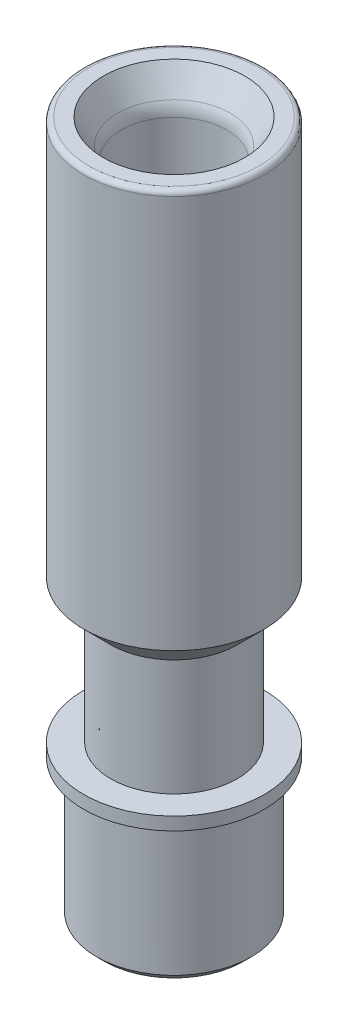
ISO-10303-21;
HEADER;
FILE_DESCRIPTION(('STEP AP214'),'2;1');
FILE_NAME('part.step','',(''),(''),'','','');
FILE_SCHEMA(('AUTOMOTIVE_DESIGN { 1 0 10303 214 1 1 1 1 }'));
ENDSEC;
DATA;
#1=APPLICATION_CONTEXT('core data for automotive mechanical design processes');
#2=APPLICATION_PROTOCOL_DEFINITION('international standard','automotive_design',2000,#1);
#3=PRODUCT_CONTEXT('',#1,'mechanical');
#4=PRODUCT('Part','Part','',(#3));
#5=PRODUCT_RELATED_PRODUCT_CATEGORY('part','',(#4));
#6=PRODUCT_DEFINITION_FORMATION('','',#4);
#7=PRODUCT_DEFINITION_CONTEXT('part definition',#1,'design');
#8=PRODUCT_DEFINITION('design','',#6,#7);
#9=PRODUCT_DEFINITION_SHAPE('','',#8);
#10=(LENGTH_UNIT() NAMED_UNIT(*) SI_UNIT(.MILLI.,.METRE.));
#11=(NAMED_UNIT(*) PLANE_ANGLE_UNIT() SI_UNIT($,.RADIAN.));
#12=(NAMED_UNIT(*) SI_UNIT($,.STERADIAN.) SOLID_ANGLE_UNIT());
#13=UNCERTAINTY_MEASURE_WITH_UNIT(LENGTH_MEASURE(1.E-05),#10,'distance_accuracy_value','');
#14=(GEOMETRIC_REPRESENTATION_CONTEXT(3) GLOBAL_UNCERTAINTY_ASSIGNED_CONTEXT((#13)) GLOBAL_UNIT_ASSIGNED_CONTEXT((#10,
#11,#12)) REPRESENTATION_CONTEXT('',''));
#15=CARTESIAN_POINT('',(0.,0.,0.));
#16=DIRECTION('',(0.,0.,1.));
#17=DIRECTION('',(1.,0.,0.));
#18=AXIS2_PLACEMENT_3D('',#15,#16,#17);
#19=CARTESIAN_POINT('',(0.,11.55,0.));
#20=DIRECTION('',(0.,1.,0.));
#21=DIRECTION('',(-1.,0.,0.));
#22=AXIS2_PLACEMENT_3D('',#19,#20,#21);
#23=CONICAL_SURFACE('',#22,3.5,0.78539816339745);
#24=CARTESIAN_POINT('',(0.,10.5,0.));
#25=DIRECTION('',(0.,-1.,0.));
#26=DIRECTION('',(1.,0.,0.));
#27=AXIS2_PLACEMENT_3D('',#24,#25,#26);
#28=CIRCLE('',#27,2.45);
#29=CARTESIAN_POINT('',(2.45,10.5,0.));
#30=VERTEX_POINT('',#29);
#31=EDGE_CURVE('E62',#30,#30,#28,.T.);
#32=ORIENTED_EDGE('',*,*,#31,.F.);
#33=EDGE_LOOP('',(#32));
#34=FACE_BOUND('',#33,.T.);
#35=CARTESIAN_POINT('',(0.,11.55,0.));
#36=DIRECTION('',(0.,-1.,0.));
#37=DIRECTION('',(1.,0.,0.));
#38=AXIS2_PLACEMENT_3D('',#35,#36,#37);
#39=CIRCLE('',#38,3.5);
#40=CARTESIAN_POINT('',(3.5,11.55,0.));
#41=VERTEX_POINT('',#40);
#42=EDGE_CURVE('E41',#41,#41,#39,.T.);
#43=ORIENTED_EDGE('',*,*,#42,.T.);
#44=EDGE_LOOP('',(#43));
#45=FACE_BOUND('',#44,.T.);
#46=ADVANCED_FACE('F15',(#34,#45),#23,.T.);
#47=CARTESIAN_POINT('',(0.,0.,0.));
#48=DIRECTION('',(0.,-1.,0.));
#49=DIRECTION('',(1.,0.,0.));
#50=AXIS2_PLACEMENT_3D('',#47,#48,#49);
#51=CYLINDRICAL_SURFACE('',#50,3.5);
#52=CARTESIAN_POINT('',(0.,26.8,0.));
#53=DIRECTION('',(0.,-1.,0.));
#54=DIRECTION('',(1.,0.,0.));
#55=AXIS2_PLACEMENT_3D('',#52,#53,#54);
#56=CIRCLE('',#55,3.5);
#57=CARTESIAN_POINT('',(3.5,26.8,0.));
#58=VERTEX_POINT('',#57);
#59=EDGE_CURVE('E28',#58,#58,#56,.T.);
#60=ORIENTED_EDGE('',*,*,#59,.T.);
#61=EDGE_LOOP('',(#60));
#62=FACE_BOUND('',#61,.T.);
#63=ORIENTED_EDGE('',*,*,#42,.F.);
#64=EDGE_LOOP('',(#63));
#65=FACE_BOUND('',#64,.T.);
#66=ADVANCED_FACE('F67',(#62,#65),#51,.T.);
#67=CARTESIAN_POINT('',(-2.74282032302756,27.,0.));
#68=DIRECTION('',(0.,-1.,0.));
#69=DIRECTION('',(1.,0.,0.));
#70=AXIS2_PLACEMENT_3D('',#67,#68,#69);
#71=PLANE('',#70);
#72=CARTESIAN_POINT('',(0.,27.,0.));
#73=DIRECTION('',(0.,-1.,0.));
#74=DIRECTION('',(1.,0.,0.));
#75=AXIS2_PLACEMENT_3D('',#72,#73,#74);
#76=CIRCLE('',#75,3.3);
#77=CARTESIAN_POINT('',(3.3,27.,0.));
#78=VERTEX_POINT('',#77);
#79=EDGE_CURVE('E27',#78,#78,#76,.F.);
#80=ORIENTED_EDGE('',*,*,#79,.T.);
#81=EDGE_LOOP('',(#80));
#82=FACE_BOUND('',#81,.T.);
#83=CARTESIAN_POINT('',(0.,27.,0.));
#84=DIRECTION('',(0.,-1.,0.));
#85=DIRECTION('',(1.,0.,0.));
#86=AXIS2_PLACEMENT_3D('',#83,#84,#85);
#87=CIRCLE('',#86,2.74282032302756);
#88=CARTESIAN_POINT('',(2.74282032302756,27.,0.));
#89=VERTEX_POINT('',#88);
#90=EDGE_CURVE('E42',#89,#89,#87,.T.);
#91=ORIENTED_EDGE('',*,*,#90,.T.);
#92=EDGE_LOOP('',(#91));
#93=FACE_BOUND('',#92,.T.);
#94=ADVANCED_FACE('F74',(#82,#93),#71,.F.);
#95=CARTESIAN_POINT('',(0.,25.8,0.));
#96=DIRECTION('',(0.,1.,0.));
#97=DIRECTION('',(-1.,0.,0.));
#98=AXIS2_PLACEMENT_3D('',#95,#96,#97);
#99=CONICAL_SURFACE('',#98,2.05,0.5235987755983);
#100=CARTESIAN_POINT('',(0.,26.0320508075689,0.));
#101=DIRECTION('',(0.,-1.,0.));
#102=DIRECTION('',(1.,0.,0.));
#103=AXIS2_PLACEMENT_3D('',#100,#101,#102);
#104=CIRCLE('',#103,2.18397459621556);
#105=CARTESIAN_POINT('',(2.18397459621556,26.0320508075689,0.));
#106=VERTEX_POINT('',#105);
#107=EDGE_CURVE('E36',#106,#106,#104,.T.);
#108=ORIENTED_EDGE('',*,*,#107,.T.);
#109=EDGE_LOOP('',(#108));
#110=FACE_BOUND('',#109,.T.);
#111=ORIENTED_EDGE('',*,*,#90,.F.);
#112=EDGE_LOOP('',(#111));
#113=FACE_BOUND('',#112,.T.);
#114=ADVANCED_FACE('F84',(#110,#113),#99,.F.);
#115=CARTESIAN_POINT('',(0.,0.,0.));
#116=DIRECTION('',(0.,-1.,0.));
#117=DIRECTION('',(1.,0.,0.));
#118=AXIS2_PLACEMENT_3D('',#115,#116,#117);
#119=CYLINDRICAL_SURFACE('',#118,2.05);
#120=CARTESIAN_POINT('',(0.,25.5320508075689,0.));
#121=DIRECTION('',(0.,1.,0.));
#122=DIRECTION('',(-1.,0.,0.));
#123=AXIS2_PLACEMENT_3D('',#120,#121,#122);
#124=CIRCLE('',#123,2.05);
#125=CARTESIAN_POINT('',(-2.05,25.5320508075689,0.));
#126=VERTEX_POINT('',#125);
#127=EDGE_CURVE('E34',#126,#126,#124,.T.);
#128=ORIENTED_EDGE('',*,*,#127,.T.);
#129=EDGE_LOOP('',(#128));
#130=FACE_BOUND('',#129,.T.);
#131=CARTESIAN_POINT('',(0.,0.,0.));
#132=DIRECTION('',(0.,-1.,0.));
#133=DIRECTION('',(1.,0.,0.));
#134=AXIS2_PLACEMENT_3D('',#131,#132,#133);
#135=CIRCLE('',#134,2.05);
#136=CARTESIAN_POINT('',(2.05,0.,0.));
#137=VERTEX_POINT('',#136);
#138=EDGE_CURVE('E50',#137,#137,#135,.T.);
#139=ORIENTED_EDGE('',*,*,#138,.T.);
#140=EDGE_LOOP('',(#139));
#141=FACE_BOUND('',#140,.T.);
#142=ADVANCED_FACE('F106',(#130,#141),#119,.F.);
#143=CARTESIAN_POINT('',(-2.05,0.,0.));
#144=DIRECTION('',(0.,1.,0.));
#145=DIRECTION('',(-1.,0.,0.));
#146=AXIS2_PLACEMENT_3D('',#143,#144,#145);
#147=PLANE('',#146);
#148=CARTESIAN_POINT('',(0.,0.,0.));
#149=DIRECTION('',(0.,1.,0.));
#150=DIRECTION('',(-1.,0.,0.));
#151=AXIS2_PLACEMENT_3D('',#148,#149,#150);
#152=CIRCLE('',#151,2.7);
#153=CARTESIAN_POINT('',(-2.7,0.,0.));
#154=VERTEX_POINT('',#153);
#155=EDGE_CURVE('E22',#154,#154,#152,.F.);
#156=ORIENTED_EDGE('',*,*,#155,.T.);
#157=EDGE_LOOP('',(#156));
#158=FACE_BOUND('',#157,.T.);
#159=ORIENTED_EDGE('',*,*,#138,.F.);
#160=EDGE_LOOP('',(#159));
#161=FACE_BOUND('',#160,.T.);
#162=ADVANCED_FACE('F115',(#158,#161),#147,.F.);
#163=CARTESIAN_POINT('',(0.,0.,0.));
#164=DIRECTION('',(0.,-1.,0.));
#165=DIRECTION('',(1.,0.,0.));
#166=AXIS2_PLACEMENT_3D('',#163,#164,#165);
#167=CYLINDRICAL_SURFACE('',#166,3.);
#168=CARTESIAN_POINT('',(0.,0.3,0.));
#169=DIRECTION('',(0.,1.,0.));
#170=DIRECTION('',(-1.,0.,0.));
#171=AXIS2_PLACEMENT_3D('',#168,#169,#170);
#172=CIRCLE('',#171,3.);
#173=CARTESIAN_POINT('',(-3.,0.3,0.));
#174=VERTEX_POINT('',#173);
#175=EDGE_CURVE('E10',#174,#174,#172,.T.);
#176=ORIENTED_EDGE('',*,*,#175,.T.);
#177=EDGE_LOOP('',(#176));
#178=FACE_BOUND('',#177,.T.);
#179=CARTESIAN_POINT('',(0.,5.5,0.));
#180=DIRECTION('',(0.,-1.,0.));
#181=DIRECTION('',(1.,0.,0.));
#182=AXIS2_PLACEMENT_3D('',#179,#180,#181);
#183=CIRCLE('',#182,3.);
#184=CARTESIAN_POINT('',(3.,5.5,0.));
#185=VERTEX_POINT('',#184);
#186=EDGE_CURVE('E49',#185,#185,#183,.T.);
#187=ORIENTED_EDGE('',*,*,#186,.T.);
#188=EDGE_LOOP('',(#187));
#189=FACE_BOUND('',#188,.T.);
#190=ADVANCED_FACE('F119',(#178,#189),#167,.T.);
#191=CARTESIAN_POINT('',(-3.,5.5,0.));
#192=DIRECTION('',(0.,1.,0.));
#193=DIRECTION('',(-1.,0.,0.));
#194=AXIS2_PLACEMENT_3D('',#191,#192,#193);
#195=PLANE('',#194);
#196=ORIENTED_EDGE('',*,*,#186,.F.);
#197=EDGE_LOOP('',(#196));
#198=FACE_BOUND('',#197,.T.);
#199=CARTESIAN_POINT('',(0.,5.5,0.));
#200=DIRECTION('',(0.,-1.,0.));
#201=DIRECTION('',(1.,0.,0.));
#202=AXIS2_PLACEMENT_3D('',#199,#200,#201);
#203=CIRCLE('',#202,3.5);
#204=CARTESIAN_POINT('',(3.5,5.5,0.));
#205=VERTEX_POINT('',#204);
#206=EDGE_CURVE('E52',#205,#205,#203,.T.);
#207=ORIENTED_EDGE('',*,*,#206,.T.);
#208=EDGE_LOOP('',(#207));
#209=FACE_BOUND('',#208,.T.);
#210=ADVANCED_FACE('F124',(#198,#209),#195,.F.);
#211=CARTESIAN_POINT('',(0.,0.,0.));
#212=DIRECTION('',(0.,-1.,0.));
#213=DIRECTION('',(1.,0.,0.));
#214=AXIS2_PLACEMENT_3D('',#211,#212,#213);
#215=CYLINDRICAL_SURFACE('',#214,3.5);
#216=ORIENTED_EDGE('',*,*,#206,.F.);
#217=EDGE_LOOP('',(#216));
#218=FACE_BOUND('',#217,.T.);
#219=CARTESIAN_POINT('',(0.,6.,0.));
#220=DIRECTION('',(0.,-1.,0.));
#221=DIRECTION('',(1.,0.,0.));
#222=AXIS2_PLACEMENT_3D('',#219,#220,#221);
#223=CIRCLE('',#222,3.5);
#224=CARTESIAN_POINT('',(3.5,6.,0.));
#225=VERTEX_POINT('',#224);
#226=EDGE_CURVE('E57',#225,#225,#223,.T.);
#227=ORIENTED_EDGE('',*,*,#226,.T.);
#228=EDGE_LOOP('',(#227));
#229=FACE_BOUND('',#228,.T.);
#230=ADVANCED_FACE('F123',(#218,#229),#215,.T.);
#231=CARTESIAN_POINT('',(-3.5,6.,0.));
#232=DIRECTION('',(0.,-1.,0.));
#233=DIRECTION('',(1.,0.,0.));
#234=AXIS2_PLACEMENT_3D('',#231,#232,#233);
#235=PLANE('',#234);
#236=ORIENTED_EDGE('',*,*,#226,.F.);
#237=EDGE_LOOP('',(#236));
#238=FACE_BOUND('',#237,.T.);
#239=CARTESIAN_POINT('',(0.,6.,0.));
#240=DIRECTION('',(0.,-1.,0.));
#241=DIRECTION('',(1.,0.,0.));
#242=AXIS2_PLACEMENT_3D('',#239,#240,#241);
#243=CIRCLE('',#242,2.45);
#244=CARTESIAN_POINT('',(2.45,6.,0.));
#245=VERTEX_POINT('',#244);
#246=EDGE_CURVE('E56',#245,#245,#243,.T.);
#247=ORIENTED_EDGE('',*,*,#246,.T.);
#248=EDGE_LOOP('',(#247));
#249=FACE_BOUND('',#248,.T.);
#250=ADVANCED_FACE('F128',(#238,#249),#235,.F.);
#251=CARTESIAN_POINT('',(0.,0.,0.));
#252=DIRECTION('',(0.,-1.,0.));
#253=DIRECTION('',(1.,0.,0.));
#254=AXIS2_PLACEMENT_3D('',#251,#252,#253);
#255=CYLINDRICAL_SURFACE('',#254,2.45);
#256=ORIENTED_EDGE('',*,*,#246,.F.);
#257=EDGE_LOOP('',(#256));
#258=FACE_BOUND('',#257,.T.);
#259=ORIENTED_EDGE('',*,*,#31,.T.);
#260=EDGE_LOOP('',(#259));
#261=FACE_BOUND('',#260,.T.);
#262=ADVANCED_FACE('F69',(#258,#261),#255,.T.);
#263=CARTESIAN_POINT('',(0.,25.5320508075689,0.));
#264=DIRECTION('',(0.,1.,0.));
#265=DIRECTION('',(-1.,0.,0.));
#266=AXIS2_PLACEMENT_3D('',#263,#264,#265);
#267=TOROIDAL_SURFACE('',#266,3.05,1.);
#268=ORIENTED_EDGE('',*,*,#127,.F.);
#269=EDGE_LOOP('',(#268));
#270=FACE_BOUND('',#269,.T.);
#271=ORIENTED_EDGE('',*,*,#107,.F.);
#272=EDGE_LOOP('',(#271));
#273=FACE_BOUND('',#272,.T.);
#274=ADVANCED_FACE('F86',(#270,#273),#267,.T.);
#275=CARTESIAN_POINT('',(0.,26.8,0.));
#276=DIRECTION('',(0.,-1.,0.));
#277=DIRECTION('',(1.,0.,0.));
#278=AXIS2_PLACEMENT_3D('',#275,#276,#277);
#279=TOROIDAL_SURFACE('',#278,3.3,0.2);
#280=ORIENTED_EDGE('',*,*,#79,.F.);
#281=EDGE_LOOP('',(#280));
#282=FACE_BOUND('',#281,.T.);
#283=ORIENTED_EDGE('',*,*,#59,.F.);
#284=EDGE_LOOP('',(#283));
#285=FACE_BOUND('',#284,.T.);
#286=ADVANCED_FACE('F89',(#282,#285),#279,.T.);
#287=CARTESIAN_POINT('',(0.,0.,0.));
#288=DIRECTION('',(0.,1.,0.));
#289=DIRECTION('',(-1.,0.,0.));
#290=AXIS2_PLACEMENT_3D('',#287,#288,#289);
#291=CONICAL_SURFACE('',#290,2.7,0.785398163397448);
#292=ORIENTED_EDGE('',*,*,#175,.F.);
#293=EDGE_LOOP('',(#292));
#294=FACE_BOUND('',#293,.T.);
#295=ORIENTED_EDGE('',*,*,#155,.F.);
#296=EDGE_LOOP('',(#295));
#297=FACE_BOUND('',#296,.T.);
#298=ADVANCED_FACE('F17',(#294,#297),#291,.T.);
#299=CLOSED_SHELL('',(#46,#66,#94,#114,#142,#162,#190,#210,#230,#250,#262,#274,#286,#298));
#300=MANIFOLD_SOLID_BREP('B1',#299);
#301=ADVANCED_BREP_SHAPE_REPRESENTATION('',(#18,#300),#14);
#302=SHAPE_DEFINITION_REPRESENTATION(#9,#301);
ENDSEC;
END-ISO-10303-21;
